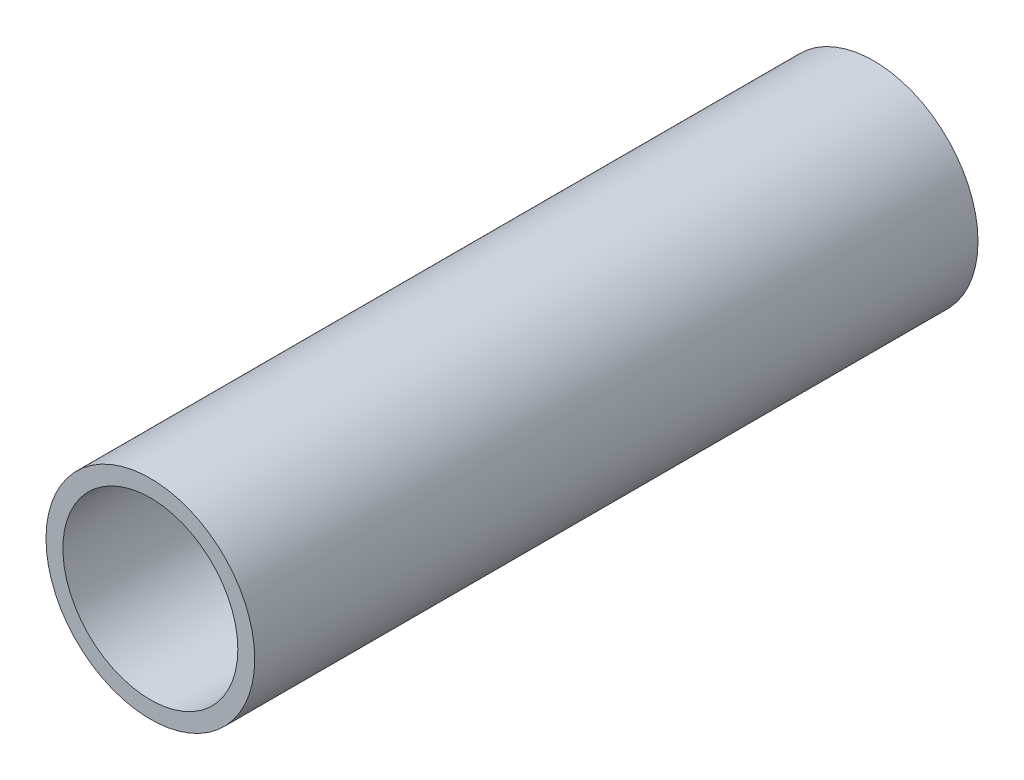
ISO-10303-21;
HEADER;
FILE_DESCRIPTION(('STEP AP214'),'2;1');
FILE_NAME('part.step','',(''),(''),'','','');
FILE_SCHEMA(('AUTOMOTIVE_DESIGN { 1 0 10303 214 1 1 1 1 }'));
ENDSEC;
DATA;
#1=APPLICATION_CONTEXT('core data for automotive mechanical design processes');
#2=APPLICATION_PROTOCOL_DEFINITION('international standard','automotive_design',2000,#1);
#3=PRODUCT_CONTEXT('',#1,'mechanical');
#4=PRODUCT('Part','Part','',(#3));
#5=PRODUCT_RELATED_PRODUCT_CATEGORY('part','',(#4));
#6=PRODUCT_DEFINITION_FORMATION('','',#4);
#7=PRODUCT_DEFINITION_CONTEXT('part definition',#1,'design');
#8=PRODUCT_DEFINITION('design','',#6,#7);
#9=PRODUCT_DEFINITION_SHAPE('','',#8);
#10=(LENGTH_UNIT() NAMED_UNIT(*) SI_UNIT(.MILLI.,.METRE.));
#11=(NAMED_UNIT(*) PLANE_ANGLE_UNIT() SI_UNIT($,.RADIAN.));
#12=(NAMED_UNIT(*) SI_UNIT($,.STERADIAN.) SOLID_ANGLE_UNIT());
#13=UNCERTAINTY_MEASURE_WITH_UNIT(LENGTH_MEASURE(1.E-05),#10,'distance_accuracy_value','');
#14=(GEOMETRIC_REPRESENTATION_CONTEXT(3) GLOBAL_UNCERTAINTY_ASSIGNED_CONTEXT((#13)) GLOBAL_UNIT_ASSIGNED_CONTEXT((#10,
#11,#12)) REPRESENTATION_CONTEXT('',''));
#15=CARTESIAN_POINT('',(0.,0.,0.));
#16=DIRECTION('',(0.,0.,1.));
#17=DIRECTION('',(1.,0.,0.));
#18=AXIS2_PLACEMENT_3D('',#15,#16,#17);
#19=CARTESIAN_POINT('',(0.,0.,210.));
#20=DIRECTION('',(0.,0.,1.));
#21=DIRECTION('',(1.,0.,0.));
#22=AXIS2_PLACEMENT_3D('',#19,#20,#21);
#23=PLANE('',#22);
#24=CARTESIAN_POINT('',(0.,0.,210.));
#25=DIRECTION('',(0.,0.,1.));
#26=DIRECTION('',(1.,0.,0.));
#27=AXIS2_PLACEMENT_3D('',#24,#25,#26);
#28=CIRCLE('',#27,30.3);
#29=CARTESIAN_POINT('',(30.3,0.,210.));
#30=VERTEX_POINT('',#29);
#31=EDGE_CURVE('E10',#30,#30,#28,.T.);
#32=ORIENTED_EDGE('',*,*,#31,.T.);
#33=EDGE_LOOP('',(#32));
#34=FACE_BOUND('',#33,.T.);
#35=CARTESIAN_POINT('',(0.,0.,210.));
#36=DIRECTION('',(0.,0.,1.));
#37=DIRECTION('',(1.,0.,0.));
#38=AXIS2_PLACEMENT_3D('',#35,#36,#37);
#39=CIRCLE('',#38,25.4);
#40=CARTESIAN_POINT('',(25.4,0.,210.));
#41=VERTEX_POINT('',#40);
#42=EDGE_CURVE('E54',#41,#41,#39,.T.);
#43=ORIENTED_EDGE('',*,*,#42,.F.);
#44=EDGE_LOOP('',(#43));
#45=FACE_BOUND('',#44,.T.);
#46=ADVANCED_FACE('F41',(#34,#45),#23,.T.);
#47=CARTESIAN_POINT('',(0.,0.,0.));
#48=DIRECTION('',(0.,0.,1.));
#49=DIRECTION('',(1.,0.,0.));
#50=AXIS2_PLACEMENT_3D('',#47,#48,#49);
#51=PLANE('',#50);
#52=CARTESIAN_POINT('',(0.,0.,0.));
#53=DIRECTION('',(0.,0.,1.));
#54=DIRECTION('',(1.,0.,0.));
#55=AXIS2_PLACEMENT_3D('',#52,#53,#54);
#56=CIRCLE('',#55,30.3);
#57=CARTESIAN_POINT('',(30.3,0.,0.));
#58=VERTEX_POINT('',#57);
#59=EDGE_CURVE('E45',#58,#58,#56,.T.);
#60=ORIENTED_EDGE('',*,*,#59,.F.);
#61=EDGE_LOOP('',(#60));
#62=FACE_BOUND('',#61,.T.);
#63=CARTESIAN_POINT('',(0.,0.,0.));
#64=DIRECTION('',(0.,0.,1.));
#65=DIRECTION('',(1.,0.,0.));
#66=AXIS2_PLACEMENT_3D('',#63,#64,#65);
#67=CIRCLE('',#66,25.4);
#68=CARTESIAN_POINT('',(25.4,0.,0.));
#69=VERTEX_POINT('',#68);
#70=EDGE_CURVE('E56',#69,#69,#67,.T.);
#71=ORIENTED_EDGE('',*,*,#70,.T.);
#72=EDGE_LOOP('',(#71));
#73=FACE_BOUND('',#72,.T.);
#74=ADVANCED_FACE('F68',(#62,#73),#51,.F.);
#75=CARTESIAN_POINT('',(0.,0.,210.));
#76=DIRECTION('',(0.,0.,-1.));
#77=DIRECTION('',(-1.,0.,0.));
#78=AXIS2_PLACEMENT_3D('',#75,#76,#77);
#79=CYLINDRICAL_SURFACE('',#78,30.3);
#80=ORIENTED_EDGE('',*,*,#31,.F.);
#81=EDGE_LOOP('',(#80));
#82=FACE_BOUND('',#81,.T.);
#83=ORIENTED_EDGE('',*,*,#59,.T.);
#84=EDGE_LOOP('',(#83));
#85=FACE_BOUND('',#84,.T.);
#86=ADVANCED_FACE('F43',(#82,#85),#79,.T.);
#87=CARTESIAN_POINT('',(0.,0.,210.));
#88=DIRECTION('',(0.,0.,-1.));
#89=DIRECTION('',(-1.,0.,0.));
#90=AXIS2_PLACEMENT_3D('',#87,#88,#89);
#91=CYLINDRICAL_SURFACE('',#90,25.4);
#92=ORIENTED_EDGE('',*,*,#42,.T.);
#93=EDGE_LOOP('',(#92));
#94=FACE_BOUND('',#93,.T.);
#95=ORIENTED_EDGE('',*,*,#70,.F.);
#96=EDGE_LOOP('',(#95));
#97=FACE_BOUND('',#96,.T.);
#98=ADVANCED_FACE('F64',(#94,#97),#91,.F.);
#99=CLOSED_SHELL('',(#46,#74,#86,#98));
#100=MANIFOLD_SOLID_BREP('B2',#99);
#101=ADVANCED_BREP_SHAPE_REPRESENTATION('',(#18,#100),#14);
#102=SHAPE_DEFINITION_REPRESENTATION(#9,#101);
ENDSEC;
END-ISO-10303-21;
